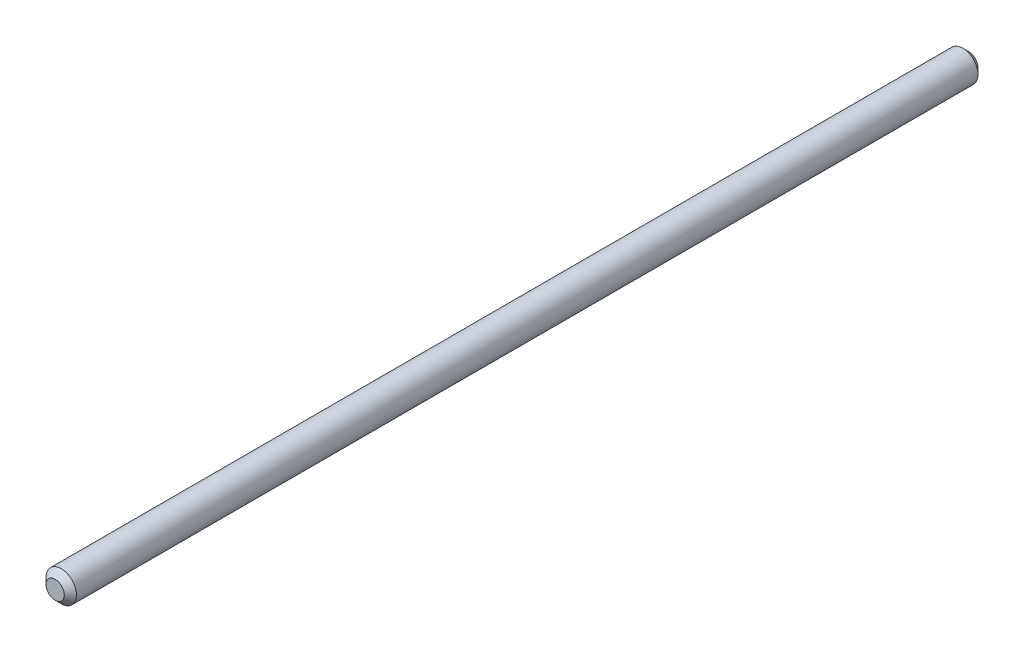
ISO-10303-21;
HEADER;
FILE_DESCRIPTION(('STEP AP214'),'2;1');
FILE_NAME('part.step','',(''),(''),'','','');
FILE_SCHEMA(('AUTOMOTIVE_DESIGN { 1 0 10303 214 1 1 1 1 }'));
ENDSEC;
DATA;
#1=APPLICATION_CONTEXT('core data for automotive mechanical design processes');
#2=APPLICATION_PROTOCOL_DEFINITION('international standard','automotive_design',2000,#1);
#3=PRODUCT_CONTEXT('',#1,'mechanical');
#4=PRODUCT('Part','Part','',(#3));
#5=PRODUCT_RELATED_PRODUCT_CATEGORY('part','',(#4));
#6=PRODUCT_DEFINITION_FORMATION('','',#4);
#7=PRODUCT_DEFINITION_CONTEXT('part definition',#1,'design');
#8=PRODUCT_DEFINITION('design','',#6,#7);
#9=PRODUCT_DEFINITION_SHAPE('','',#8);
#10=(LENGTH_UNIT() NAMED_UNIT(*) SI_UNIT(.MILLI.,.METRE.));
#11=(NAMED_UNIT(*) PLANE_ANGLE_UNIT() SI_UNIT($,.RADIAN.));
#12=(NAMED_UNIT(*) SI_UNIT($,.STERADIAN.) SOLID_ANGLE_UNIT());
#13=UNCERTAINTY_MEASURE_WITH_UNIT(LENGTH_MEASURE(1.E-05),#10,'distance_accuracy_value','');
#14=(GEOMETRIC_REPRESENTATION_CONTEXT(3) GLOBAL_UNCERTAINTY_ASSIGNED_CONTEXT((#13)) GLOBAL_UNIT_ASSIGNED_CONTEXT((#10,
#11,#12)) REPRESENTATION_CONTEXT('',''));
#15=CARTESIAN_POINT('',(0.,0.,0.));
#16=DIRECTION('',(0.,0.,1.));
#17=DIRECTION('',(1.,0.,0.));
#18=AXIS2_PLACEMENT_3D('',#15,#16,#17);
#19=CARTESIAN_POINT('',(0.,0.,150.));
#20=DIRECTION('',(0.,0.,-1.));
#21=DIRECTION('',(-1.,0.,0.));
#22=AXIS2_PLACEMENT_3D('',#19,#20,#21);
#23=CYLINDRICAL_SURFACE('',#22,2.5);
#24=CARTESIAN_POINT('',(0.,0.,149.));
#25=DIRECTION('',(0.,0.,1.));
#26=DIRECTION('',(1.,0.,0.));
#27=AXIS2_PLACEMENT_3D('',#24,#25,#26);
#28=CIRCLE('',#27,2.5);
#29=CARTESIAN_POINT('',(2.5,0.,149.));
#30=VERTEX_POINT('',#29);
#31=EDGE_CURVE('E40',#30,#30,#28,.F.);
#32=ORIENTED_EDGE('',*,*,#31,.T.);
#33=EDGE_LOOP('',(#32));
#34=FACE_BOUND('',#33,.T.);
#35=CARTESIAN_POINT('',(0.,0.,0.999999999999973));
#36=DIRECTION('',(0.,0.,1.));
#37=DIRECTION('',(1.,0.,0.));
#38=AXIS2_PLACEMENT_3D('',#35,#36,#37);
#39=CIRCLE('',#38,2.5);
#40=CARTESIAN_POINT('',(2.5,0.,0.999999999999973));
#41=VERTEX_POINT('',#40);
#42=EDGE_CURVE('E44',#41,#41,#39,.T.);
#43=ORIENTED_EDGE('',*,*,#42,.T.);
#44=EDGE_LOOP('',(#43));
#45=FACE_BOUND('',#44,.T.);
#46=ADVANCED_FACE('F33',(#34,#45),#23,.T.);
#47=CARTESIAN_POINT('',(0.,0.,150.));
#48=DIRECTION('',(0.,0.,1.));
#49=DIRECTION('',(1.,0.,0.));
#50=AXIS2_PLACEMENT_3D('',#47,#48,#49);
#51=PLANE('',#50);
#52=CARTESIAN_POINT('',(0.,0.,150.));
#53=DIRECTION('',(0.,0.,1.));
#54=DIRECTION('',(1.,0.,0.));
#55=AXIS2_PLACEMENT_3D('',#52,#53,#54);
#56=CIRCLE('',#55,1.5);
#57=CARTESIAN_POINT('',(1.5,0.,150.));
#58=VERTEX_POINT('',#57);
#59=EDGE_CURVE('E48',#58,#58,#56,.T.);
#60=ORIENTED_EDGE('',*,*,#59,.T.);
#61=EDGE_LOOP('',(#60));
#62=FACE_BOUND('',#61,.T.);
#63=ADVANCED_FACE('F54',(#62),#51,.T.);
#64=CARTESIAN_POINT('',(0.,0.,0.));
#65=DIRECTION('',(0.,0.,1.));
#66=DIRECTION('',(1.,0.,0.));
#67=AXIS2_PLACEMENT_3D('',#64,#65,#66);
#68=PLANE('',#67);
#69=CARTESIAN_POINT('',(0.,0.,0.));
#70=DIRECTION('',(0.,0.,1.));
#71=DIRECTION('',(1.,0.,0.));
#72=AXIS2_PLACEMENT_3D('',#69,#70,#71);
#73=CIRCLE('',#72,1.50000000000004);
#74=CARTESIAN_POINT('',(1.50000000000004,0.,0.));
#75=VERTEX_POINT('',#74);
#76=EDGE_CURVE('E10',#75,#75,#73,.F.);
#77=ORIENTED_EDGE('',*,*,#76,.T.);
#78=EDGE_LOOP('',(#77));
#79=FACE_BOUND('',#78,.T.);
#80=ADVANCED_FACE('F58',(#79),#68,.F.);
#81=CARTESIAN_POINT('',(0.,0.,150.));
#82=DIRECTION('',(0.,0.,-1.));
#83=DIRECTION('',(-1.,0.,0.));
#84=AXIS2_PLACEMENT_3D('',#81,#82,#83);
#85=CONICAL_SURFACE('',#84,1.5,0.785398163397461);
#86=ORIENTED_EDGE('',*,*,#31,.F.);
#87=EDGE_LOOP('',(#86));
#88=FACE_BOUND('',#87,.T.);
#89=ORIENTED_EDGE('',*,*,#59,.F.);
#90=EDGE_LOOP('',(#89));
#91=FACE_BOUND('',#90,.T.);
#92=ADVANCED_FACE('F56',(#88,#91),#85,.T.);
#93=CARTESIAN_POINT('',(0.,0.,0.999999999999973));
#94=DIRECTION('',(0.,0.,1.));
#95=DIRECTION('',(1.,0.,0.));
#96=AXIS2_PLACEMENT_3D('',#93,#94,#95);
#97=CONICAL_SURFACE('',#96,2.5,0.78539816339744);
#98=ORIENTED_EDGE('',*,*,#76,.F.);
#99=EDGE_LOOP('',(#98));
#100=FACE_BOUND('',#99,.T.);
#101=ORIENTED_EDGE('',*,*,#42,.F.);
#102=EDGE_LOOP('',(#101));
#103=FACE_BOUND('',#102,.T.);
#104=ADVANCED_FACE('F35',(#100,#103),#97,.T.);
#105=CLOSED_SHELL('',(#46,#63,#80,#92,#104));
#106=MANIFOLD_SOLID_BREP('B2',#105);
#107=ADVANCED_BREP_SHAPE_REPRESENTATION('',(#18,#106),#14);
#108=SHAPE_DEFINITION_REPRESENTATION(#9,#107);
ENDSEC;
END-ISO-10303-21;
